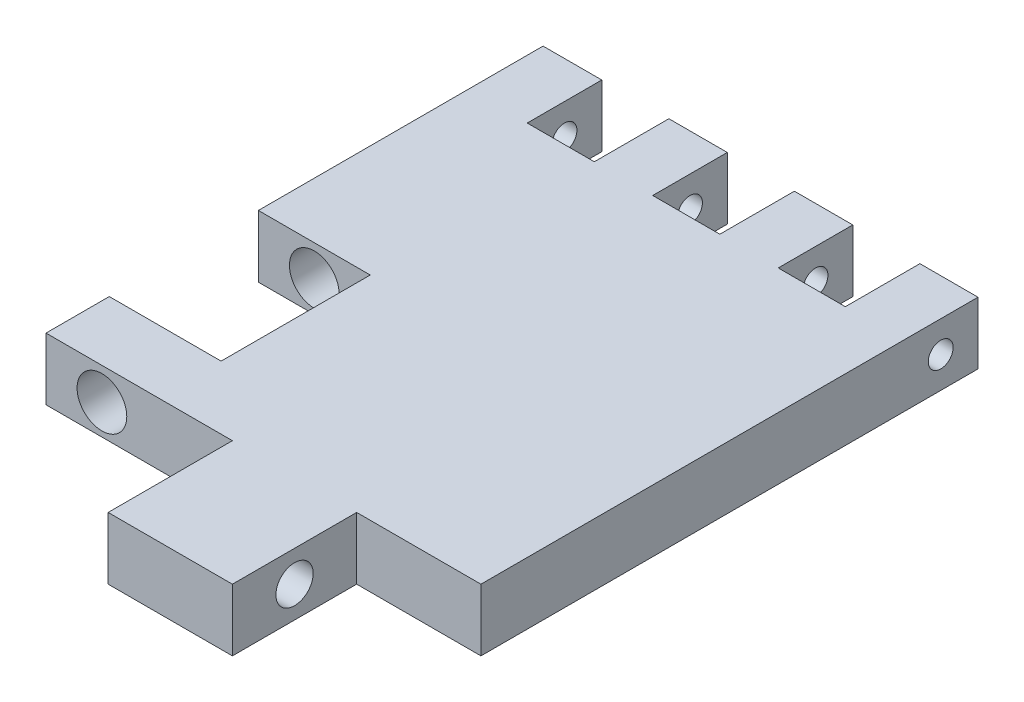
ISO-10303-21;
HEADER;
FILE_DESCRIPTION(('STEP AP214'),'2;1');
FILE_NAME('part.step','',(''),(''),'','','');
FILE_SCHEMA(('AUTOMOTIVE_DESIGN { 1 0 10303 214 1 1 1 1 }'));
ENDSEC;
DATA;
#1=APPLICATION_CONTEXT('core data for automotive mechanical design processes');
#2=APPLICATION_PROTOCOL_DEFINITION('international standard','automotive_design',2000,#1);
#3=PRODUCT_CONTEXT('',#1,'mechanical');
#4=PRODUCT('Part','Part','',(#3));
#5=PRODUCT_RELATED_PRODUCT_CATEGORY('part','',(#4));
#6=PRODUCT_DEFINITION_FORMATION('','',#4);
#7=PRODUCT_DEFINITION_CONTEXT('part definition',#1,'design');
#8=PRODUCT_DEFINITION('design','',#6,#7);
#9=PRODUCT_DEFINITION_SHAPE('','',#8);
#10=(LENGTH_UNIT() NAMED_UNIT(*) SI_UNIT(.MILLI.,.METRE.));
#11=(NAMED_UNIT(*) PLANE_ANGLE_UNIT() SI_UNIT($,.RADIAN.));
#12=(NAMED_UNIT(*) SI_UNIT($,.STERADIAN.) SOLID_ANGLE_UNIT());
#13=UNCERTAINTY_MEASURE_WITH_UNIT(LENGTH_MEASURE(1.E-05),#10,'distance_accuracy_value','');
#14=(GEOMETRIC_REPRESENTATION_CONTEXT(3) GLOBAL_UNCERTAINTY_ASSIGNED_CONTEXT((#13)) GLOBAL_UNIT_ASSIGNED_CONTEXT((#10,
#11,#12)) REPRESENTATION_CONTEXT('',''));
#15=CARTESIAN_POINT('',(0.,0.,0.));
#16=DIRECTION('',(0.,0.,1.));
#17=DIRECTION('',(1.,0.,0.));
#18=AXIS2_PLACEMENT_3D('',#15,#16,#17);
#19=CARTESIAN_POINT('',(0.,12.7,0.));
#20=DIRECTION('',(1.,0.,0.));
#21=DIRECTION('',(0.,0.,-1.));
#22=AXIS2_PLACEMENT_3D('',#19,#20,#21);
#23=PLANE('',#22);
#24=CARTESIAN_POINT('',(0.,6.35,-93.98));
#25=DIRECTION('',(-1.,0.,0.));
#26=DIRECTION('',(0.,0.,1.));
#27=AXIS2_PLACEMENT_3D('',#24,#25,#26);
#28=CIRCLE('',#27,2.54);
#29=CARTESIAN_POINT('',(0.,6.35,-91.44));
#30=VERTEX_POINT('',#29);
#31=EDGE_CURVE('E270',#30,#30,#28,.T.);
#32=ORIENTED_EDGE('',*,*,#31,.F.);
#33=EDGE_LOOP('',(#32));
#34=FACE_BOUND('',#33,.T.);
#35=DIRECTION('',(0.,0.,1.));
#36=VECTOR('',#35,1.);
#37=CARTESIAN_POINT('',(0.,0.,0.));
#38=LINE('',#37,#36);
#39=CARTESIAN_POINT('',(0.,0.,-101.6));
#40=VERTEX_POINT('',#39);
#41=CARTESIAN_POINT('',(0.,0.,-43.412925587905));
#42=VERTEX_POINT('',#41);
#43=EDGE_CURVE('E220',#40,#42,#38,.T.);
#44=ORIENTED_EDGE('',*,*,#43,.T.);
#45=DIRECTION('',(0.,-1.,0.));
#46=VECTOR('',#45,1.);
#47=CARTESIAN_POINT('',(0.,18.288,-43.412925587905));
#48=LINE('',#47,#46);
#49=CARTESIAN_POINT('',(0.,12.7,-43.412925587905));
#50=VERTEX_POINT('',#49);
#51=EDGE_CURVE('E214',#50,#42,#48,.T.);
#52=ORIENTED_EDGE('',*,*,#51,.F.);
#53=DIRECTION('',(0.,0.,1.));
#54=VECTOR('',#53,1.);
#55=CARTESIAN_POINT('',(0.,12.7,0.));
#56=LINE('',#55,#54);
#57=CARTESIAN_POINT('',(0.,12.7,-101.6));
#58=VERTEX_POINT('',#57);
#59=EDGE_CURVE('E381',#58,#50,#56,.T.);
#60=ORIENTED_EDGE('',*,*,#59,.F.);
#61=DIRECTION('',(0.,-1.,0.));
#62=VECTOR('',#61,1.);
#63=CARTESIAN_POINT('',(0.,12.7,-101.6));
#64=LINE('',#63,#62);
#65=EDGE_CURVE('E247',#58,#40,#64,.T.);
#66=ORIENTED_EDGE('',*,*,#65,.T.);
#67=EDGE_LOOP('',(#44,#52,#60,#66));
#68=FACE_BOUND('',#67,.T.);
#69=ADVANCED_FACE('F35',(#34,#68),#23,.F.);
#70=CARTESIAN_POINT('',(0.,12.7,-101.6));
#71=DIRECTION('',(0.,0.,1.));
#72=DIRECTION('',(1.,0.,0.));
#73=AXIS2_PLACEMENT_3D('',#70,#71,#72);
#74=PLANE('',#73);
#75=DIRECTION('',(-1.,0.,0.));
#76=VECTOR('',#75,1.);
#77=CARTESIAN_POINT('',(0.,12.7,-101.6));
#78=LINE('',#77,#76);
#79=CARTESIAN_POINT('',(63.308,12.7,-101.6));
#80=VERTEX_POINT('',#79);
#81=CARTESIAN_POINT('',(51.37,12.7,-101.6));
#82=VERTEX_POINT('',#81);
#83=EDGE_CURVE('E399',#80,#82,#78,.T.);
#84=ORIENTED_EDGE('',*,*,#83,.F.);
#85=DIRECTION('',(0.,1.,0.));
#86=VECTOR('',#85,1.);
#87=CARTESIAN_POINT('',(63.308,0.,-101.6));
#88=LINE('',#87,#86);
#89=CARTESIAN_POINT('',(63.308,0.,-101.6));
#90=VERTEX_POINT('',#89);
#91=EDGE_CURVE('E325',#90,#80,#88,.T.);
#92=ORIENTED_EDGE('',*,*,#91,.F.);
#93=DIRECTION('',(-1.,0.,0.));
#94=VECTOR('',#93,1.);
#95=CARTESIAN_POINT('',(0.,0.,-101.6));
#96=LINE('',#95,#94);
#97=CARTESIAN_POINT('',(51.37,0.,-101.6));
#98=VERTEX_POINT('',#97);
#99=EDGE_CURVE('E245',#90,#98,#96,.T.);
#100=ORIENTED_EDGE('',*,*,#99,.T.);
#101=DIRECTION('',(0.,1.,0.));
#102=VECTOR('',#101,1.);
#103=CARTESIAN_POINT('',(51.37,0.,-101.6));
#104=LINE('',#103,#102);
#105=EDGE_CURVE('E352',#98,#82,#104,.T.);
#106=ORIENTED_EDGE('',*,*,#105,.T.);
#107=EDGE_LOOP('',(#84,#92,#100,#106));
#108=FACE_BOUND('',#107,.T.);
#109=ADVANCED_FACE('F412',(#108),#74,.F.);
#110=CARTESIAN_POINT('',(37.654,12.7,-101.6));
#111=VERTEX_POINT('',#110);
#112=CARTESIAN_POINT('',(25.716,12.7,-101.6));
#113=VERTEX_POINT('',#112);
#114=EDGE_CURVE('E398',#111,#113,#78,.T.);
#115=ORIENTED_EDGE('',*,*,#114,.F.);
#116=DIRECTION('',(0.,1.,0.));
#117=VECTOR('',#116,1.);
#118=CARTESIAN_POINT('',(37.654,0.,-101.6));
#119=LINE('',#118,#117);
#120=CARTESIAN_POINT('',(37.654,0.,-101.6));
#121=VERTEX_POINT('',#120);
#122=EDGE_CURVE('E321',#121,#111,#119,.T.);
#123=ORIENTED_EDGE('',*,*,#122,.F.);
#124=CARTESIAN_POINT('',(25.716,0.,-101.6));
#125=VERTEX_POINT('',#124);
#126=EDGE_CURVE('E246',#121,#125,#96,.T.);
#127=ORIENTED_EDGE('',*,*,#126,.T.);
#128=DIRECTION('',(0.,1.,0.));
#129=VECTOR('',#128,1.);
#130=CARTESIAN_POINT('',(25.716,0.,-101.6));
#131=LINE('',#130,#129);
#132=EDGE_CURVE('E224',#125,#113,#131,.T.);
#133=ORIENTED_EDGE('',*,*,#132,.T.);
#134=EDGE_LOOP('',(#115,#123,#127,#133));
#135=FACE_BOUND('',#134,.T.);
#136=ADVANCED_FACE('F428',(#135),#74,.F.);
#137=CARTESIAN_POINT('',(12.,12.7,-101.6));
#138=VERTEX_POINT('',#137);
#139=EDGE_CURVE('E394',#138,#58,#78,.T.);
#140=ORIENTED_EDGE('',*,*,#139,.F.);
#141=DIRECTION('',(0.,1.,0.));
#142=VECTOR('',#141,1.);
#143=CARTESIAN_POINT('',(12.,0.,-101.6));
#144=LINE('',#143,#142);
#145=CARTESIAN_POINT('',(12.,0.,-101.6));
#146=VERTEX_POINT('',#145);
#147=EDGE_CURVE('E221',#146,#138,#144,.T.);
#148=ORIENTED_EDGE('',*,*,#147,.F.);
#149=EDGE_CURVE('E241',#146,#40,#96,.T.);
#150=ORIENTED_EDGE('',*,*,#149,.T.);
#151=ORIENTED_EDGE('',*,*,#65,.F.);
#152=EDGE_LOOP('',(#140,#148,#150,#151));
#153=FACE_BOUND('',#152,.T.);
#154=ADVANCED_FACE('F441',(#153),#74,.F.);
#155=CARTESIAN_POINT('',(0.,12.7,-12.932925587905));
#156=VERTEX_POINT('',#155);
#157=CARTESIAN_POINT('',(0.,12.7,0.));
#158=VERTEX_POINT('',#157);
#159=EDGE_CURVE('E213',#156,#158,#56,.T.);
#160=ORIENTED_EDGE('',*,*,#159,.F.);
#161=DIRECTION('',(0.,-1.,0.));
#162=VECTOR('',#161,1.);
#163=CARTESIAN_POINT('',(0.,18.288,-12.932925587905));
#164=LINE('',#163,#162);
#165=CARTESIAN_POINT('',(0.,0.,-12.932925587905));
#166=VERTEX_POINT('',#165);
#167=EDGE_CURVE('E201',#156,#166,#164,.T.);
#168=ORIENTED_EDGE('',*,*,#167,.T.);
#169=CARTESIAN_POINT('',(0.,0.,0.));
#170=VERTEX_POINT('',#169);
#171=EDGE_CURVE('E211',#166,#170,#38,.T.);
#172=ORIENTED_EDGE('',*,*,#171,.T.);
#173=DIRECTION('',(0.,-1.,0.));
#174=VECTOR('',#173,1.);
#175=CARTESIAN_POINT('',(0.,12.7,0.));
#176=LINE('',#175,#174);
#177=EDGE_CURVE('E11',#158,#170,#176,.T.);
#178=ORIENTED_EDGE('',*,*,#177,.F.);
#179=EDGE_LOOP('',(#160,#168,#172,#178));
#180=FACE_BOUND('',#179,.T.);
#181=ADVANCED_FACE('F37',(#180),#23,.F.);
#182=CARTESIAN_POINT('',(0.,12.7,0.));
#183=DIRECTION('',(0.,0.,-1.));
#184=DIRECTION('',(-1.,0.,0.));
#185=AXIS2_PLACEMENT_3D('',#182,#183,#184);
#186=PLANE('',#185);
#187=CARTESIAN_POINT('',(11.43,6.16874082807506,0.));
#188=DIRECTION('',(0.,0.,1.));
#189=DIRECTION('',(1.,0.,0.));
#190=AXIS2_PLACEMENT_3D('',#187,#188,#189);
#191=CIRCLE('',#190,5.08);
#192=CARTESIAN_POINT('',(16.51,6.16874082807506,0.));
#193=VERTEX_POINT('',#192);
#194=EDGE_CURVE('E460',#193,#193,#191,.T.);
#195=ORIENTED_EDGE('',*,*,#194,.F.);
#196=EDGE_LOOP('',(#195));
#197=FACE_BOUND('',#196,.T.);
#198=DIRECTION('',(1.,0.,0.));
#199=VECTOR('',#198,1.);
#200=CARTESIAN_POINT('',(0.,0.,0.));
#201=LINE('',#200,#199);
#202=CARTESIAN_POINT('',(38.1,0.,0.));
#203=VERTEX_POINT('',#202);
#204=EDGE_CURVE('E219',#170,#203,#201,.T.);
#205=ORIENTED_EDGE('',*,*,#204,.T.);
#206=DIRECTION('',(0.,-1.,0.));
#207=VECTOR('',#206,1.);
#208=CARTESIAN_POINT('',(38.1,12.7,0.));
#209=LINE('',#208,#207);
#210=CARTESIAN_POINT('',(38.1,12.7,0.));
#211=VERTEX_POINT('',#210);
#212=EDGE_CURVE('E44',#211,#203,#209,.T.);
#213=ORIENTED_EDGE('',*,*,#212,.F.);
#214=DIRECTION('',(1.,0.,0.));
#215=VECTOR('',#214,1.);
#216=CARTESIAN_POINT('',(0.,12.7,0.));
#217=LINE('',#216,#215);
#218=EDGE_CURVE('E384',#158,#211,#217,.T.);
#219=ORIENTED_EDGE('',*,*,#218,.F.);
#220=ORIENTED_EDGE('',*,*,#177,.T.);
#221=EDGE_LOOP('',(#205,#213,#219,#220));
#222=FACE_BOUND('',#221,.T.);
#223=ADVANCED_FACE('F494',(#197,#222),#186,.F.);
#224=CARTESIAN_POINT('',(38.1,12.7,0.));
#225=DIRECTION('',(1.,0.,0.));
#226=DIRECTION('',(0.,0.,-1.));
#227=AXIS2_PLACEMENT_3D('',#224,#225,#226);
#228=PLANE('',#227);
#229=CARTESIAN_POINT('',(38.1,6.35,12.7));
#230=DIRECTION('',(1.,0.,0.));
#231=DIRECTION('',(0.,0.,-1.));
#232=AXIS2_PLACEMENT_3D('',#229,#230,#231);
#233=CIRCLE('',#232,3.81);
#234=CARTESIAN_POINT('',(38.1,6.35,8.88999999999998));
#235=VERTEX_POINT('',#234);
#236=EDGE_CURVE('E273',#235,#235,#233,.T.);
#237=ORIENTED_EDGE('',*,*,#236,.T.);
#238=EDGE_LOOP('',(#237));
#239=FACE_BOUND('',#238,.T.);
#240=DIRECTION('',(0.,0.,1.));
#241=VECTOR('',#240,1.);
#242=CARTESIAN_POINT('',(38.1,0.,0.));
#243=LINE('',#242,#241);
#244=CARTESIAN_POINT('',(38.1,0.,25.4000000000001));
#245=VERTEX_POINT('',#244);
#246=EDGE_CURVE('E231',#203,#245,#243,.T.);
#247=ORIENTED_EDGE('',*,*,#246,.T.);
#248=DIRECTION('',(0.,-1.,0.));
#249=VECTOR('',#248,1.);
#250=CARTESIAN_POINT('',(38.1,12.7,25.4000000000001));
#251=LINE('',#250,#249);
#252=CARTESIAN_POINT('',(38.1,12.7,25.4000000000001));
#253=VERTEX_POINT('',#252);
#254=EDGE_CURVE('E262',#253,#245,#251,.T.);
#255=ORIENTED_EDGE('',*,*,#254,.F.);
#256=DIRECTION('',(0.,0.,1.));
#257=VECTOR('',#256,1.);
#258=CARTESIAN_POINT('',(38.1,12.7,0.));
#259=LINE('',#258,#257);
#260=EDGE_CURVE('E386',#211,#253,#259,.T.);
#261=ORIENTED_EDGE('',*,*,#260,.F.);
#262=ORIENTED_EDGE('',*,*,#212,.T.);
#263=EDGE_LOOP('',(#247,#255,#261,#262));
#264=FACE_BOUND('',#263,.T.);
#265=ADVANCED_FACE('F499',(#239,#264),#228,.F.);
#266=CARTESIAN_POINT('',(63.5,12.7,25.4000000000001));
#267=DIRECTION('',(0.,0.,-1.));
#268=DIRECTION('',(-1.,0.,0.));
#269=AXIS2_PLACEMENT_3D('',#266,#267,#268);
#270=PLANE('',#269);
#271=DIRECTION('',(1.,0.,0.));
#272=VECTOR('',#271,1.);
#273=CARTESIAN_POINT('',(63.5,0.,25.4000000000001));
#274=LINE('',#273,#272);
#275=CARTESIAN_POINT('',(63.5,0.,25.4000000000001));
#276=VERTEX_POINT('',#275);
#277=EDGE_CURVE('E233',#245,#276,#274,.T.);
#278=ORIENTED_EDGE('',*,*,#277,.T.);
#279=DIRECTION('',(0.,-1.,0.));
#280=VECTOR('',#279,1.);
#281=CARTESIAN_POINT('',(63.5,12.7,25.4000000000001));
#282=LINE('',#281,#280);
#283=CARTESIAN_POINT('',(63.5,12.7,25.4000000000001));
#284=VERTEX_POINT('',#283);
#285=EDGE_CURVE('E259',#284,#276,#282,.T.);
#286=ORIENTED_EDGE('',*,*,#285,.F.);
#287=DIRECTION('',(1.,0.,0.));
#288=VECTOR('',#287,1.);
#289=CARTESIAN_POINT('',(63.5,12.7,25.4000000000001));
#290=LINE('',#289,#288);
#291=EDGE_CURVE('E388',#253,#284,#290,.T.);
#292=ORIENTED_EDGE('',*,*,#291,.F.);
#293=ORIENTED_EDGE('',*,*,#254,.T.);
#294=EDGE_LOOP('',(#278,#286,#292,#293));
#295=FACE_BOUND('',#294,.T.);
#296=ADVANCED_FACE('F708',(#295),#270,.F.);
#297=CARTESIAN_POINT('',(63.5,12.7,0.));
#298=DIRECTION('',(-1.,0.,0.));
#299=DIRECTION('',(0.,0.,1.));
#300=AXIS2_PLACEMENT_3D('',#297,#298,#299);
#301=PLANE('',#300);
#302=CARTESIAN_POINT('',(63.5,6.35,12.7));
#303=DIRECTION('',(-1.,0.,0.));
#304=DIRECTION('',(0.,0.,1.));
#305=AXIS2_PLACEMENT_3D('',#302,#303,#304);
#306=CIRCLE('',#305,3.81);
#307=CARTESIAN_POINT('',(63.5,6.35,16.51));
#308=VERTEX_POINT('',#307);
#309=EDGE_CURVE('E271',#308,#308,#306,.T.);
#310=ORIENTED_EDGE('',*,*,#309,.T.);
#311=EDGE_LOOP('',(#310));
#312=FACE_BOUND('',#311,.T.);
#313=DIRECTION('',(0.,0.,-1.));
#314=VECTOR('',#313,1.);
#315=CARTESIAN_POINT('',(63.5,0.,0.));
#316=LINE('',#315,#314);
#317=CARTESIAN_POINT('',(63.5,0.,0.));
#318=VERTEX_POINT('',#317);
#319=EDGE_CURVE('E235',#276,#318,#316,.T.);
#320=ORIENTED_EDGE('',*,*,#319,.T.);
#321=DIRECTION('',(0.,-1.,0.));
#322=VECTOR('',#321,1.);
#323=CARTESIAN_POINT('',(63.5,12.7,0.));
#324=LINE('',#323,#322);
#325=CARTESIAN_POINT('',(63.5,12.7,0.));
#326=VERTEX_POINT('',#325);
#327=EDGE_CURVE('E256',#326,#318,#324,.T.);
#328=ORIENTED_EDGE('',*,*,#327,.F.);
#329=DIRECTION('',(0.,0.,-1.));
#330=VECTOR('',#329,1.);
#331=CARTESIAN_POINT('',(63.5,12.7,0.));
#332=LINE('',#331,#330);
#333=EDGE_CURVE('E390',#284,#326,#332,.T.);
#334=ORIENTED_EDGE('',*,*,#333,.F.);
#335=ORIENTED_EDGE('',*,*,#285,.T.);
#336=EDGE_LOOP('',(#320,#328,#334,#335));
#337=FACE_BOUND('',#336,.T.);
#338=ADVANCED_FACE('F700',(#312,#337),#301,.F.);
#339=CARTESIAN_POINT('',(63.5,12.7,0.));
#340=DIRECTION('',(0.,0.,-1.));
#341=DIRECTION('',(-1.,0.,0.));
#342=AXIS2_PLACEMENT_3D('',#339,#340,#341);
#343=PLANE('',#342);
#344=DIRECTION('',(1.,0.,0.));
#345=VECTOR('',#344,1.);
#346=CARTESIAN_POINT('',(63.5,0.,0.));
#347=LINE('',#346,#345);
#348=CARTESIAN_POINT('',(88.9,0.,0.));
#349=VERTEX_POINT('',#348);
#350=EDGE_CURVE('E237',#318,#349,#347,.T.);
#351=ORIENTED_EDGE('',*,*,#350,.T.);
#352=DIRECTION('',(0.,-1.,0.));
#353=VECTOR('',#352,1.);
#354=CARTESIAN_POINT('',(88.9,12.7,0.));
#355=LINE('',#354,#353);
#356=CARTESIAN_POINT('',(88.9,12.7,0.));
#357=VERTEX_POINT('',#356);
#358=EDGE_CURVE('E253',#357,#349,#355,.T.);
#359=ORIENTED_EDGE('',*,*,#358,.F.);
#360=DIRECTION('',(1.,0.,0.));
#361=VECTOR('',#360,1.);
#362=CARTESIAN_POINT('',(63.5,12.7,0.));
#363=LINE('',#362,#361);
#364=EDGE_CURVE('E392',#326,#357,#363,.T.);
#365=ORIENTED_EDGE('',*,*,#364,.F.);
#366=ORIENTED_EDGE('',*,*,#327,.T.);
#367=EDGE_LOOP('',(#351,#359,#365,#366));
#368=FACE_BOUND('',#367,.T.);
#369=ADVANCED_FACE('F514',(#368),#343,.F.);
#370=CARTESIAN_POINT('',(88.9,12.7,0.));
#371=DIRECTION('',(-1.,0.,0.));
#372=DIRECTION('',(0.,0.,1.));
#373=AXIS2_PLACEMENT_3D('',#370,#371,#372);
#374=PLANE('',#373);
#375=CARTESIAN_POINT('',(88.9,6.35,-93.98));
#376=DIRECTION('',(-1.,0.,0.));
#377=DIRECTION('',(0.,0.,1.));
#378=AXIS2_PLACEMENT_3D('',#375,#376,#377);
#379=CIRCLE('',#378,2.54);
#380=CARTESIAN_POINT('',(88.9,6.35,-91.44));
#381=VERTEX_POINT('',#380);
#382=EDGE_CURVE('E304',#381,#381,#379,.T.);
#383=ORIENTED_EDGE('',*,*,#382,.T.);
#384=EDGE_LOOP('',(#383));
#385=FACE_BOUND('',#384,.T.);
#386=DIRECTION('',(0.,0.,-1.));
#387=VECTOR('',#386,1.);
#388=CARTESIAN_POINT('',(88.9,0.,0.));
#389=LINE('',#388,#387);
#390=CARTESIAN_POINT('',(88.9,0.,-101.6));
#391=VERTEX_POINT('',#390);
#392=EDGE_CURVE('E239',#349,#391,#389,.T.);
#393=ORIENTED_EDGE('',*,*,#392,.T.);
#394=DIRECTION('',(0.,-1.,0.));
#395=VECTOR('',#394,1.);
#396=CARTESIAN_POINT('',(88.9,12.7,-101.6));
#397=LINE('',#396,#395);
#398=CARTESIAN_POINT('',(88.9,12.7,-101.6));
#399=VERTEX_POINT('',#398);
#400=EDGE_CURVE('E250',#399,#391,#397,.T.);
#401=ORIENTED_EDGE('',*,*,#400,.F.);
#402=DIRECTION('',(0.,0.,-1.));
#403=VECTOR('',#402,1.);
#404=CARTESIAN_POINT('',(88.9,12.7,0.));
#405=LINE('',#404,#403);
#406=EDGE_CURVE('E393',#357,#399,#405,.T.);
#407=ORIENTED_EDGE('',*,*,#406,.F.);
#408=ORIENTED_EDGE('',*,*,#358,.T.);
#409=EDGE_LOOP('',(#393,#401,#407,#408));
#410=FACE_BOUND('',#409,.T.);
#411=ADVANCED_FACE('F507',(#385,#410),#374,.F.);
#412=CARTESIAN_POINT('',(77.024,0.,-101.6));
#413=VERTEX_POINT('',#412);
#414=EDGE_CURVE('E242',#391,#413,#96,.T.);
#415=ORIENTED_EDGE('',*,*,#414,.T.);
#416=DIRECTION('',(0.,1.,0.));
#417=VECTOR('',#416,1.);
#418=CARTESIAN_POINT('',(77.024,0.,-101.6));
#419=LINE('',#418,#417);
#420=CARTESIAN_POINT('',(77.024,12.7,-101.6));
#421=VERTEX_POINT('',#420);
#422=EDGE_CURVE('E328',#413,#421,#419,.T.);
#423=ORIENTED_EDGE('',*,*,#422,.T.);
#424=EDGE_CURVE('E228',#399,#421,#78,.T.);
#425=ORIENTED_EDGE('',*,*,#424,.F.);
#426=ORIENTED_EDGE('',*,*,#400,.T.);
#427=EDGE_LOOP('',(#415,#423,#425,#426));
#428=FACE_BOUND('',#427,.T.);
#429=ADVANCED_FACE('F491',(#428),#74,.F.);
#430=CARTESIAN_POINT('',(0.,12.7,0.));
#431=DIRECTION('',(0.,-1.,0.));
#432=DIRECTION('',(0.,0.,-1.));
#433=AXIS2_PLACEMENT_3D('',#430,#431,#432);
#434=PLANE('',#433);
#435=ORIENTED_EDGE('',*,*,#59,.T.);
#436=DIRECTION('',(1.,0.,0.));
#437=VECTOR('',#436,1.);
#438=CARTESIAN_POINT('',(0.,12.7,-43.412925587905));
#439=LINE('',#438,#437);
#440=CARTESIAN_POINT('',(22.86,12.7,-43.412925587905));
#441=VERTEX_POINT('',#440);
#442=EDGE_CURVE('E280',#50,#441,#439,.T.);
#443=ORIENTED_EDGE('',*,*,#442,.T.);
#444=DIRECTION('',(0.,0.,1.));
#445=VECTOR('',#444,1.);
#446=CARTESIAN_POINT('',(22.86,12.7,0.));
#447=LINE('',#446,#445);
#448=CARTESIAN_POINT('',(22.86,12.7,-12.932925587905));
#449=VERTEX_POINT('',#448);
#450=EDGE_CURVE('E274',#441,#449,#447,.T.);
#451=ORIENTED_EDGE('',*,*,#450,.T.);
#452=DIRECTION('',(-1.,0.,0.));
#453=VECTOR('',#452,1.);
#454=CARTESIAN_POINT('',(0.,12.7,-12.932925587905));
#455=LINE('',#454,#453);
#456=EDGE_CURVE('E284',#449,#156,#455,.T.);
#457=ORIENTED_EDGE('',*,*,#456,.T.);
#458=ORIENTED_EDGE('',*,*,#159,.T.);
#459=ORIENTED_EDGE('',*,*,#218,.T.);
#460=ORIENTED_EDGE('',*,*,#260,.T.);
#461=ORIENTED_EDGE('',*,*,#291,.T.);
#462=ORIENTED_EDGE('',*,*,#333,.T.);
#463=ORIENTED_EDGE('',*,*,#364,.T.);
#464=ORIENTED_EDGE('',*,*,#406,.T.);
#465=ORIENTED_EDGE('',*,*,#424,.T.);
#466=DIRECTION('',(0.,0.,-1.));
#467=VECTOR('',#466,1.);
#468=CARTESIAN_POINT('',(77.024,12.7,-101.6));
#469=LINE('',#468,#467);
#470=CARTESIAN_POINT('',(77.024,12.7,-86.36));
#471=VERTEX_POINT('',#470);
#472=EDGE_CURVE('E312',#471,#421,#469,.T.);
#473=ORIENTED_EDGE('',*,*,#472,.F.);
#474=DIRECTION('',(1.,0.,0.));
#475=VECTOR('',#474,1.);
#476=CARTESIAN_POINT('',(63.308,12.7,-86.36));
#477=LINE('',#476,#475);
#478=CARTESIAN_POINT('',(63.308,12.7,-86.36));
#479=VERTEX_POINT('',#478);
#480=EDGE_CURVE('E320',#479,#471,#477,.T.);
#481=ORIENTED_EDGE('',*,*,#480,.F.);
#482=DIRECTION('',(0.,0.,1.));
#483=VECTOR('',#482,1.);
#484=CARTESIAN_POINT('',(63.308,12.7,-101.6));
#485=LINE('',#484,#483);
#486=EDGE_CURVE('E317',#80,#479,#485,.T.);
#487=ORIENTED_EDGE('',*,*,#486,.F.);
#488=ORIENTED_EDGE('',*,*,#83,.T.);
#489=DIRECTION('',(0.,0.,-1.));
#490=VECTOR('',#489,1.);
#491=CARTESIAN_POINT('',(51.37,12.7,-101.6));
#492=LINE('',#491,#490);
#493=CARTESIAN_POINT('',(51.37,12.7,-86.36));
#494=VERTEX_POINT('',#493);
#495=EDGE_CURVE('E338',#494,#82,#492,.T.);
#496=ORIENTED_EDGE('',*,*,#495,.F.);
#497=DIRECTION('',(1.,0.,0.));
#498=VECTOR('',#497,1.);
#499=CARTESIAN_POINT('',(37.654,12.7,-86.36));
#500=LINE('',#499,#498);
#501=CARTESIAN_POINT('',(37.654,12.7,-86.36));
#502=VERTEX_POINT('',#501);
#503=EDGE_CURVE('E347',#502,#494,#500,.T.);
#504=ORIENTED_EDGE('',*,*,#503,.F.);
#505=DIRECTION('',(0.,0.,1.));
#506=VECTOR('',#505,1.);
#507=CARTESIAN_POINT('',(37.654,12.7,-101.6));
#508=LINE('',#507,#506);
#509=EDGE_CURVE('E307',#111,#502,#508,.T.);
#510=ORIENTED_EDGE('',*,*,#509,.F.);
#511=ORIENTED_EDGE('',*,*,#114,.T.);
#512=DIRECTION('',(0.,0.,-1.));
#513=VECTOR('',#512,1.);
#514=CARTESIAN_POINT('',(25.716,12.7,-101.6));
#515=LINE('',#514,#513);
#516=CARTESIAN_POINT('',(25.716,12.7,-86.36));
#517=VERTEX_POINT('',#516);
#518=EDGE_CURVE('E362',#517,#113,#515,.T.);
#519=ORIENTED_EDGE('',*,*,#518,.F.);
#520=DIRECTION('',(1.,0.,0.));
#521=VECTOR('',#520,1.);
#522=CARTESIAN_POINT('',(12.,12.7,-86.36));
#523=LINE('',#522,#521);
#524=CARTESIAN_POINT('',(12.,12.7,-86.36));
#525=VERTEX_POINT('',#524);
#526=EDGE_CURVE('E371',#525,#517,#523,.T.);
#527=ORIENTED_EDGE('',*,*,#526,.F.);
#528=DIRECTION('',(0.,0.,1.));
#529=VECTOR('',#528,1.);
#530=CARTESIAN_POINT('',(12.,12.7,-101.6));
#531=LINE('',#530,#529);
#532=EDGE_CURVE('E327',#138,#525,#531,.T.);
#533=ORIENTED_EDGE('',*,*,#532,.F.);
#534=ORIENTED_EDGE('',*,*,#139,.T.);
#535=EDGE_LOOP('',(#435,#443,#451,#457,#458,#459,#460,#461,#462,#463,#464,#465,#473,#481,#487,
#488,#496,#504,#510,#511,#519,#527,#533,#534));
#536=FACE_BOUND('',#535,.T.);
#537=ADVANCED_FACE('F407',(#536),#434,.F.);
#538=CARTESIAN_POINT('',(0.,0.,0.));
#539=DIRECTION('',(0.,-1.,0.));
#540=DIRECTION('',(0.,0.,-1.));
#541=AXIS2_PLACEMENT_3D('',#538,#539,#540);
#542=PLANE('',#541);
#543=DIRECTION('',(1.,0.,0.));
#544=VECTOR('',#543,1.);
#545=CARTESIAN_POINT('',(22.86,0.,-43.412925587905));
#546=LINE('',#545,#544);
#547=CARTESIAN_POINT('',(22.86,0.,-43.412925587905));
#548=VERTEX_POINT('',#547);
#549=EDGE_CURVE('E206',#42,#548,#546,.T.);
#550=ORIENTED_EDGE('',*,*,#549,.F.);
#551=ORIENTED_EDGE('',*,*,#43,.F.);
#552=ORIENTED_EDGE('',*,*,#149,.F.);
#553=DIRECTION('',(0.,0.,1.));
#554=VECTOR('',#553,1.);
#555=CARTESIAN_POINT('',(12.,0.,-101.6));
#556=LINE('',#555,#554);
#557=CARTESIAN_POINT('',(12.,0.,-86.36));
#558=VERTEX_POINT('',#557);
#559=EDGE_CURVE('E358',#146,#558,#556,.T.);
#560=ORIENTED_EDGE('',*,*,#559,.T.);
#561=DIRECTION('',(1.,0.,0.));
#562=VECTOR('',#561,1.);
#563=CARTESIAN_POINT('',(12.,0.,-86.36));
#564=LINE('',#563,#562);
#565=CARTESIAN_POINT('',(25.716,0.,-86.36));
#566=VERTEX_POINT('',#565);
#567=EDGE_CURVE('E361',#558,#566,#564,.T.);
#568=ORIENTED_EDGE('',*,*,#567,.T.);
#569=DIRECTION('',(0.,0.,-1.));
#570=VECTOR('',#569,1.);
#571=CARTESIAN_POINT('',(25.716,0.,-101.6));
#572=LINE('',#571,#570);
#573=EDGE_CURVE('E365',#566,#125,#572,.T.);
#574=ORIENTED_EDGE('',*,*,#573,.T.);
#575=ORIENTED_EDGE('',*,*,#126,.F.);
#576=DIRECTION('',(0.,0.,1.));
#577=VECTOR('',#576,1.);
#578=CARTESIAN_POINT('',(37.654,0.,-101.6));
#579=LINE('',#578,#577);
#580=CARTESIAN_POINT('',(37.654,0.,-86.36));
#581=VERTEX_POINT('',#580);
#582=EDGE_CURVE('E334',#121,#581,#579,.T.);
#583=ORIENTED_EDGE('',*,*,#582,.T.);
#584=DIRECTION('',(1.,0.,0.));
#585=VECTOR('',#584,1.);
#586=CARTESIAN_POINT('',(37.654,0.,-86.36));
#587=LINE('',#586,#585);
#588=CARTESIAN_POINT('',(51.37,0.,-86.36));
#589=VERTEX_POINT('',#588);
#590=EDGE_CURVE('E337',#581,#589,#587,.T.);
#591=ORIENTED_EDGE('',*,*,#590,.T.);
#592=DIRECTION('',(0.,0.,-1.));
#593=VECTOR('',#592,1.);
#594=CARTESIAN_POINT('',(51.37,0.,-101.6));
#595=LINE('',#594,#593);
#596=EDGE_CURVE('E341',#589,#98,#595,.T.);
#597=ORIENTED_EDGE('',*,*,#596,.T.);
#598=ORIENTED_EDGE('',*,*,#99,.F.);
#599=DIRECTION('',(0.,0.,1.));
#600=VECTOR('',#599,1.);
#601=CARTESIAN_POINT('',(63.308,0.,-101.6));
#602=LINE('',#601,#600);
#603=CARTESIAN_POINT('',(63.308,0.,-86.36));
#604=VERTEX_POINT('',#603);
#605=EDGE_CURVE('E308',#90,#604,#602,.T.);
#606=ORIENTED_EDGE('',*,*,#605,.T.);
#607=DIRECTION('',(1.,0.,0.));
#608=VECTOR('',#607,1.);
#609=CARTESIAN_POINT('',(63.308,0.,-86.36));
#610=LINE('',#609,#608);
#611=CARTESIAN_POINT('',(77.024,0.,-86.36));
#612=VERTEX_POINT('',#611);
#613=EDGE_CURVE('E311',#604,#612,#610,.T.);
#614=ORIENTED_EDGE('',*,*,#613,.T.);
#615=DIRECTION('',(0.,0.,-1.));
#616=VECTOR('',#615,1.);
#617=CARTESIAN_POINT('',(77.024,0.,-101.6));
#618=LINE('',#617,#616);
#619=EDGE_CURVE('E60',#612,#413,#618,.T.);
#620=ORIENTED_EDGE('',*,*,#619,.T.);
#621=ORIENTED_EDGE('',*,*,#414,.F.);
#622=ORIENTED_EDGE('',*,*,#392,.F.);
#623=ORIENTED_EDGE('',*,*,#350,.F.);
#624=ORIENTED_EDGE('',*,*,#319,.F.);
#625=ORIENTED_EDGE('',*,*,#277,.F.);
#626=ORIENTED_EDGE('',*,*,#246,.F.);
#627=ORIENTED_EDGE('',*,*,#204,.F.);
#628=ORIENTED_EDGE('',*,*,#171,.F.);
#629=DIRECTION('',(-1.,0.,0.));
#630=VECTOR('',#629,1.);
#631=CARTESIAN_POINT('',(22.86,0.,-12.932925587905));
#632=LINE('',#631,#630);
#633=CARTESIAN_POINT('',(22.86,0.,-12.932925587905));
#634=VERTEX_POINT('',#633);
#635=EDGE_CURVE('E198',#634,#166,#632,.T.);
#636=ORIENTED_EDGE('',*,*,#635,.F.);
#637=DIRECTION('',(0.,0.,1.));
#638=VECTOR('',#637,1.);
#639=CARTESIAN_POINT('',(22.86,0.,-43.412925587905));
#640=LINE('',#639,#638);
#641=EDGE_CURVE('E52',#548,#634,#640,.T.);
#642=ORIENTED_EDGE('',*,*,#641,.F.);
#643=EDGE_LOOP('',(#550,#551,#552,#560,#568,#574,#575,#583,#591,#597,#598,#606,#614,#620,#621,
#622,#623,#624,#625,#626,#627,#628,#636,#642));
#644=FACE_BOUND('',#643,.T.);
#645=ADVANCED_FACE('F217',(#644),#542,.T.);
#646=CARTESIAN_POINT('',(12.,0.,-101.6));
#647=DIRECTION('',(-1.,0.,0.));
#648=DIRECTION('',(0.,0.,1.));
#649=AXIS2_PLACEMENT_3D('',#646,#647,#648);
#650=PLANE('',#649);
#651=CARTESIAN_POINT('',(12.,6.35,-93.98));
#652=DIRECTION('',(-1.,0.,0.));
#653=DIRECTION('',(0.,0.,1.));
#654=AXIS2_PLACEMENT_3D('',#651,#652,#653);
#655=CIRCLE('',#654,2.54);
#656=CARTESIAN_POINT('',(12.,6.35,-91.44));
#657=VERTEX_POINT('',#656);
#658=EDGE_CURVE('E301',#657,#657,#655,.T.);
#659=ORIENTED_EDGE('',*,*,#658,.T.);
#660=EDGE_LOOP('',(#659));
#661=FACE_BOUND('',#660,.T.);
#662=ORIENTED_EDGE('',*,*,#532,.T.);
#663=DIRECTION('',(0.,1.,0.));
#664=VECTOR('',#663,1.);
#665=CARTESIAN_POINT('',(12.,0.,-86.36));
#666=LINE('',#665,#664);
#667=EDGE_CURVE('E368',#558,#525,#666,.T.);
#668=ORIENTED_EDGE('',*,*,#667,.F.);
#669=ORIENTED_EDGE('',*,*,#559,.F.);
#670=ORIENTED_EDGE('',*,*,#147,.T.);
#671=EDGE_LOOP('',(#662,#668,#669,#670));
#672=FACE_BOUND('',#671,.T.);
#673=ADVANCED_FACE('F551',(#661,#672),#650,.F.);
#674=CARTESIAN_POINT('',(25.716,0.,-101.6));
#675=DIRECTION('',(1.,0.,0.));
#676=DIRECTION('',(0.,0.,-1.));
#677=AXIS2_PLACEMENT_3D('',#674,#675,#676);
#678=PLANE('',#677);
#679=CARTESIAN_POINT('',(25.716,6.35,-93.98));
#680=DIRECTION('',(1.,0.,0.));
#681=DIRECTION('',(0.,0.,-1.));
#682=AXIS2_PLACEMENT_3D('',#679,#680,#681);
#683=CIRCLE('',#682,2.54);
#684=CARTESIAN_POINT('',(25.716,6.35,-96.52));
#685=VERTEX_POINT('',#684);
#686=EDGE_CURVE('E298',#685,#685,#683,.T.);
#687=ORIENTED_EDGE('',*,*,#686,.T.);
#688=EDGE_LOOP('',(#687));
#689=FACE_BOUND('',#688,.T.);
#690=ORIENTED_EDGE('',*,*,#518,.T.);
#691=ORIENTED_EDGE('',*,*,#132,.F.);
#692=ORIENTED_EDGE('',*,*,#573,.F.);
#693=DIRECTION('',(0.,1.,0.));
#694=VECTOR('',#693,1.);
#695=CARTESIAN_POINT('',(25.716,0.,-86.36));
#696=LINE('',#695,#694);
#697=EDGE_CURVE('E378',#566,#517,#696,.T.);
#698=ORIENTED_EDGE('',*,*,#697,.T.);
#699=EDGE_LOOP('',(#690,#691,#692,#698));
#700=FACE_BOUND('',#699,.T.);
#701=ADVANCED_FACE('F431',(#689,#700),#678,.F.);
#702=CARTESIAN_POINT('',(12.,0.,-86.36));
#703=DIRECTION('',(0.,0.,1.));
#704=DIRECTION('',(1.,0.,0.));
#705=AXIS2_PLACEMENT_3D('',#702,#703,#704);
#706=PLANE('',#705);
#707=ORIENTED_EDGE('',*,*,#526,.T.);
#708=ORIENTED_EDGE('',*,*,#697,.F.);
#709=ORIENTED_EDGE('',*,*,#567,.F.);
#710=ORIENTED_EDGE('',*,*,#667,.T.);
#711=EDGE_LOOP('',(#707,#708,#709,#710));
#712=FACE_BOUND('',#711,.T.);
#713=ADVANCED_FACE('F436',(#712),#706,.F.);
#714=CARTESIAN_POINT('',(37.654,0.,-101.6));
#715=DIRECTION('',(-1.,0.,0.));
#716=DIRECTION('',(0.,0.,1.));
#717=AXIS2_PLACEMENT_3D('',#714,#715,#716);
#718=PLANE('',#717);
#719=CARTESIAN_POINT('',(37.654,6.35,-93.98));
#720=DIRECTION('',(-1.,0.,0.));
#721=DIRECTION('',(0.,0.,1.));
#722=AXIS2_PLACEMENT_3D('',#719,#720,#721);
#723=CIRCLE('',#722,2.54);
#724=CARTESIAN_POINT('',(37.654,6.35,-91.44));
#725=VERTEX_POINT('',#724);
#726=EDGE_CURVE('E295',#725,#725,#723,.T.);
#727=ORIENTED_EDGE('',*,*,#726,.T.);
#728=EDGE_LOOP('',(#727));
#729=FACE_BOUND('',#728,.T.);
#730=ORIENTED_EDGE('',*,*,#509,.T.);
#731=DIRECTION('',(0.,1.,0.));
#732=VECTOR('',#731,1.);
#733=CARTESIAN_POINT('',(37.654,0.,-86.36));
#734=LINE('',#733,#732);
#735=EDGE_CURVE('E344',#581,#502,#734,.T.);
#736=ORIENTED_EDGE('',*,*,#735,.F.);
#737=ORIENTED_EDGE('',*,*,#582,.F.);
#738=ORIENTED_EDGE('',*,*,#122,.T.);
#739=EDGE_LOOP('',(#730,#736,#737,#738));
#740=FACE_BOUND('',#739,.T.);
#741=ADVANCED_FACE('F542',(#729,#740),#718,.F.);
#742=CARTESIAN_POINT('',(51.37,0.,-101.6));
#743=DIRECTION('',(1.,0.,0.));
#744=DIRECTION('',(0.,0.,-1.));
#745=AXIS2_PLACEMENT_3D('',#742,#743,#744);
#746=PLANE('',#745);
#747=CARTESIAN_POINT('',(51.37,6.35,-93.98));
#748=DIRECTION('',(1.,0.,0.));
#749=DIRECTION('',(0.,0.,-1.));
#750=AXIS2_PLACEMENT_3D('',#747,#748,#749);
#751=CIRCLE('',#750,2.54);
#752=CARTESIAN_POINT('',(51.37,6.35,-96.52));
#753=VERTEX_POINT('',#752);
#754=EDGE_CURVE('E292',#753,#753,#751,.T.);
#755=ORIENTED_EDGE('',*,*,#754,.T.);
#756=EDGE_LOOP('',(#755));
#757=FACE_BOUND('',#756,.T.);
#758=ORIENTED_EDGE('',*,*,#495,.T.);
#759=ORIENTED_EDGE('',*,*,#105,.F.);
#760=ORIENTED_EDGE('',*,*,#596,.F.);
#761=DIRECTION('',(0.,1.,0.));
#762=VECTOR('',#761,1.);
#763=CARTESIAN_POINT('',(51.37,0.,-86.36));
#764=LINE('',#763,#762);
#765=EDGE_CURVE('E355',#589,#494,#764,.T.);
#766=ORIENTED_EDGE('',*,*,#765,.T.);
#767=EDGE_LOOP('',(#758,#759,#760,#766));
#768=FACE_BOUND('',#767,.T.);
#769=ADVANCED_FACE('F416',(#757,#768),#746,.F.);
#770=CARTESIAN_POINT('',(37.654,0.,-86.36));
#771=DIRECTION('',(0.,0.,1.));
#772=DIRECTION('',(1.,0.,0.));
#773=AXIS2_PLACEMENT_3D('',#770,#771,#772);
#774=PLANE('',#773);
#775=ORIENTED_EDGE('',*,*,#503,.T.);
#776=ORIENTED_EDGE('',*,*,#765,.F.);
#777=ORIENTED_EDGE('',*,*,#590,.F.);
#778=ORIENTED_EDGE('',*,*,#735,.T.);
#779=EDGE_LOOP('',(#775,#776,#777,#778));
#780=FACE_BOUND('',#779,.T.);
#781=ADVANCED_FACE('F421',(#780),#774,.F.);
#782=CARTESIAN_POINT('',(63.308,0.,-101.6));
#783=DIRECTION('',(-1.,0.,0.));
#784=DIRECTION('',(0.,0.,1.));
#785=AXIS2_PLACEMENT_3D('',#782,#783,#784);
#786=PLANE('',#785);
#787=CARTESIAN_POINT('',(63.308,6.35,-93.98));
#788=DIRECTION('',(-1.,0.,0.));
#789=DIRECTION('',(0.,0.,1.));
#790=AXIS2_PLACEMENT_3D('',#787,#788,#789);
#791=CIRCLE('',#790,2.54);
#792=CARTESIAN_POINT('',(63.308,6.35,-91.44));
#793=VERTEX_POINT('',#792);
#794=EDGE_CURVE('E269',#793,#793,#791,.T.);
#795=ORIENTED_EDGE('',*,*,#794,.T.);
#796=EDGE_LOOP('',(#795));
#797=FACE_BOUND('',#796,.T.);
#798=ORIENTED_EDGE('',*,*,#486,.T.);
#799=DIRECTION('',(0.,1.,0.));
#800=VECTOR('',#799,1.);
#801=CARTESIAN_POINT('',(63.308,0.,-86.36));
#802=LINE('',#801,#800);
#803=EDGE_CURVE('E316',#604,#479,#802,.T.);
#804=ORIENTED_EDGE('',*,*,#803,.F.);
#805=ORIENTED_EDGE('',*,*,#605,.F.);
#806=ORIENTED_EDGE('',*,*,#91,.T.);
#807=EDGE_LOOP('',(#798,#804,#805,#806));
#808=FACE_BOUND('',#807,.T.);
#809=ADVANCED_FACE('F526',(#797,#808),#786,.F.);
#810=CARTESIAN_POINT('',(77.024,0.,-101.6));
#811=DIRECTION('',(1.,0.,0.));
#812=DIRECTION('',(0.,0.,-1.));
#813=AXIS2_PLACEMENT_3D('',#810,#811,#812);
#814=PLANE('',#813);
#815=CARTESIAN_POINT('',(77.024,6.35,-93.98));
#816=DIRECTION('',(1.,0.,0.));
#817=DIRECTION('',(0.,0.,-1.));
#818=AXIS2_PLACEMENT_3D('',#815,#816,#817);
#819=CIRCLE('',#818,2.54);
#820=CARTESIAN_POINT('',(77.024,6.35,-96.52));
#821=VERTEX_POINT('',#820);
#822=EDGE_CURVE('E267',#821,#821,#819,.T.);
#823=ORIENTED_EDGE('',*,*,#822,.T.);
#824=EDGE_LOOP('',(#823));
#825=FACE_BOUND('',#824,.T.);
#826=ORIENTED_EDGE('',*,*,#472,.T.);
#827=ORIENTED_EDGE('',*,*,#422,.F.);
#828=ORIENTED_EDGE('',*,*,#619,.F.);
#829=DIRECTION('',(0.,1.,0.));
#830=VECTOR('',#829,1.);
#831=CARTESIAN_POINT('',(77.024,0.,-86.36));
#832=LINE('',#831,#830);
#833=EDGE_CURVE('E331',#612,#471,#832,.T.);
#834=ORIENTED_EDGE('',*,*,#833,.T.);
#835=EDGE_LOOP('',(#826,#827,#828,#834));
#836=FACE_BOUND('',#835,.T.);
#837=ADVANCED_FACE('F524',(#825,#836),#814,.F.);
#838=CARTESIAN_POINT('',(63.308,0.,-86.36));
#839=DIRECTION('',(0.,0.,1.));
#840=DIRECTION('',(1.,0.,0.));
#841=AXIS2_PLACEMENT_3D('',#838,#839,#840);
#842=PLANE('',#841);
#843=ORIENTED_EDGE('',*,*,#480,.T.);
#844=ORIENTED_EDGE('',*,*,#833,.F.);
#845=ORIENTED_EDGE('',*,*,#613,.F.);
#846=ORIENTED_EDGE('',*,*,#803,.T.);
#847=EDGE_LOOP('',(#843,#844,#845,#846));
#848=FACE_BOUND('',#847,.T.);
#849=ADVANCED_FACE('F522',(#848),#842,.F.);
#850=CARTESIAN_POINT('',(91.44,6.35,-93.98));
#851=DIRECTION('',(-1.,0.,0.));
#852=DIRECTION('',(0.,0.,1.));
#853=AXIS2_PLACEMENT_3D('',#850,#851,#852);
#854=CYLINDRICAL_SURFACE('',#853,2.54);
#855=ORIENTED_EDGE('',*,*,#822,.F.);
#856=EDGE_LOOP('',(#855));
#857=FACE_BOUND('',#856,.T.);
#858=ORIENTED_EDGE('',*,*,#382,.F.);
#859=EDGE_LOOP('',(#858));
#860=FACE_BOUND('',#859,.T.);
#861=ADVANCED_FACE('F533',(#857,#860),#854,.F.);
#862=ORIENTED_EDGE('',*,*,#794,.F.);
#863=EDGE_LOOP('',(#862));
#864=FACE_BOUND('',#863,.T.);
#865=ORIENTED_EDGE('',*,*,#754,.F.);
#866=EDGE_LOOP('',(#865));
#867=FACE_BOUND('',#866,.T.);
#868=ADVANCED_FACE('F607',(#864,#867),#854,.F.);
#869=ORIENTED_EDGE('',*,*,#726,.F.);
#870=EDGE_LOOP('',(#869));
#871=FACE_BOUND('',#870,.T.);
#872=ORIENTED_EDGE('',*,*,#686,.F.);
#873=EDGE_LOOP('',(#872));
#874=FACE_BOUND('',#873,.T.);
#875=ADVANCED_FACE('F617',(#871,#874),#854,.F.);
#876=ORIENTED_EDGE('',*,*,#31,.T.);
#877=EDGE_LOOP('',(#876));
#878=FACE_BOUND('',#877,.T.);
#879=ORIENTED_EDGE('',*,*,#658,.F.);
#880=EDGE_LOOP('',(#879));
#881=FACE_BOUND('',#880,.T.);
#882=ADVANCED_FACE('F609',(#878,#881),#854,.F.);
#883=CARTESIAN_POINT('',(91.44,6.35,12.7));
#884=DIRECTION('',(-1.,0.,0.));
#885=DIRECTION('',(0.,0.,1.));
#886=AXIS2_PLACEMENT_3D('',#883,#884,#885);
#887=CYLINDRICAL_SURFACE('',#886,3.81);
#888=ORIENTED_EDGE('',*,*,#309,.F.);
#889=EDGE_LOOP('',(#888));
#890=FACE_BOUND('',#889,.T.);
#891=ORIENTED_EDGE('',*,*,#236,.F.);
#892=EDGE_LOOP('',(#891));
#893=FACE_BOUND('',#892,.T.);
#894=ADVANCED_FACE('F634',(#890,#893),#887,.F.);
#895=CARTESIAN_POINT('',(22.86,18.288,-43.412925587905));
#896=DIRECTION('',(1.,0.,0.));
#897=DIRECTION('',(0.,0.,-1.));
#898=AXIS2_PLACEMENT_3D('',#895,#896,#897);
#899=PLANE('',#898);
#900=DIRECTION('',(0.,-1.,0.));
#901=VECTOR('',#900,1.);
#902=CARTESIAN_POINT('',(22.86,18.288,-43.412925587905));
#903=LINE('',#902,#901);
#904=EDGE_CURVE('E450',#441,#548,#903,.T.);
#905=ORIENTED_EDGE('',*,*,#904,.T.);
#906=ORIENTED_EDGE('',*,*,#641,.T.);
#907=DIRECTION('',(0.,-1.,0.));
#908=VECTOR('',#907,1.);
#909=CARTESIAN_POINT('',(22.86,18.288,-12.932925587905));
#910=LINE('',#909,#908);
#911=EDGE_CURVE('E203',#449,#634,#910,.T.);
#912=ORIENTED_EDGE('',*,*,#911,.F.);
#913=ORIENTED_EDGE('',*,*,#450,.F.);
#914=EDGE_LOOP('',(#905,#906,#912,#913));
#915=FACE_BOUND('',#914,.T.);
#916=ADVANCED_FACE('F642',(#915),#899,.F.);
#917=CARTESIAN_POINT('',(22.86,18.288,-43.412925587905));
#918=DIRECTION('',(0.,0.,-1.));
#919=DIRECTION('',(-1.,0.,0.));
#920=AXIS2_PLACEMENT_3D('',#917,#918,#919);
#921=PLANE('',#920);
#922=CARTESIAN_POINT('',(11.43,6.16874082807506,-43.412925587905));
#923=DIRECTION('',(0.,0.,-1.));
#924=DIRECTION('',(-1.,0.,0.));
#925=AXIS2_PLACEMENT_3D('',#922,#923,#924);
#926=CIRCLE('',#925,5.08);
#927=CARTESIAN_POINT('',(6.35,6.16874082807506,-43.412925587905));
#928=VERTEX_POINT('',#927);
#929=EDGE_CURVE('E457',#928,#928,#926,.T.);
#930=ORIENTED_EDGE('',*,*,#929,.T.);
#931=EDGE_LOOP('',(#930));
#932=FACE_BOUND('',#931,.T.);
#933=ORIENTED_EDGE('',*,*,#51,.T.);
#934=ORIENTED_EDGE('',*,*,#549,.T.);
#935=ORIENTED_EDGE('',*,*,#904,.F.);
#936=ORIENTED_EDGE('',*,*,#442,.F.);
#937=EDGE_LOOP('',(#933,#934,#935,#936));
#938=FACE_BOUND('',#937,.T.);
#939=ADVANCED_FACE('F448',(#932,#938),#921,.F.);
#940=CARTESIAN_POINT('',(22.86,18.288,-12.932925587905));
#941=DIRECTION('',(0.,0.,1.));
#942=DIRECTION('',(1.,0.,0.));
#943=AXIS2_PLACEMENT_3D('',#940,#941,#942);
#944=PLANE('',#943);
#945=CARTESIAN_POINT('',(11.43,6.16874082807506,-12.932925587905));
#946=DIRECTION('',(0.,0.,1.));
#947=DIRECTION('',(1.,0.,0.));
#948=AXIS2_PLACEMENT_3D('',#945,#946,#947);
#949=CIRCLE('',#948,5.08);
#950=CARTESIAN_POINT('',(16.51,6.16874082807506,-12.932925587905));
#951=VERTEX_POINT('',#950);
#952=EDGE_CURVE('E39',#951,#951,#949,.T.);
#953=ORIENTED_EDGE('',*,*,#952,.T.);
#954=EDGE_LOOP('',(#953));
#955=FACE_BOUND('',#954,.T.);
#956=ORIENTED_EDGE('',*,*,#911,.T.);
#957=ORIENTED_EDGE('',*,*,#635,.T.);
#958=ORIENTED_EDGE('',*,*,#167,.F.);
#959=ORIENTED_EDGE('',*,*,#456,.F.);
#960=EDGE_LOOP('',(#956,#957,#958,#959));
#961=FACE_BOUND('',#960,.T.);
#962=ADVANCED_FACE('F200',(#955,#961),#944,.F.);
#963=CARTESIAN_POINT('',(11.43,6.16874082807506,-54.61));
#964=DIRECTION('',(0.,0.,1.));
#965=DIRECTION('',(1.,0.,0.));
#966=AXIS2_PLACEMENT_3D('',#963,#964,#965);
#967=CYLINDRICAL_SURFACE('',#966,5.08);
#968=ORIENTED_EDGE('',*,*,#194,.T.);
#969=EDGE_LOOP('',(#968));
#970=FACE_BOUND('',#969,.T.);
#971=ORIENTED_EDGE('',*,*,#952,.F.);
#972=EDGE_LOOP('',(#971));
#973=FACE_BOUND('',#972,.T.);
#974=ADVANCED_FACE('F471',(#970,#973),#967,.F.);
#975=CARTESIAN_POINT('',(11.43,6.16874082807506,-54.61));
#976=DIRECTION('',(0.,0.,1.));
#977=DIRECTION('',(1.,0.,0.));
#978=AXIS2_PLACEMENT_3D('',#975,#976,#977);
#979=CIRCLE('',#978,5.08);
#980=CARTESIAN_POINT('',(16.51,6.16874082807506,-54.61));
#981=VERTEX_POINT('',#980);
#982=EDGE_CURVE('E463',#981,#981,#979,.T.);
#983=ORIENTED_EDGE('',*,*,#982,.F.);
#984=EDGE_LOOP('',(#983));
#985=FACE_BOUND('',#984,.T.);
#986=ORIENTED_EDGE('',*,*,#929,.F.);
#987=EDGE_LOOP('',(#986));
#988=FACE_BOUND('',#987,.T.);
#989=ADVANCED_FACE('F473',(#985,#988),#967,.F.);
#990=CARTESIAN_POINT('',(11.43,6.16874082807506,-54.61));
#991=DIRECTION('',(0.,0.,1.));
#992=DIRECTION('',(1.,0.,0.));
#993=AXIS2_PLACEMENT_3D('',#990,#991,#992);
#994=PLANE('',#993);
#995=ORIENTED_EDGE('',*,*,#982,.T.);
#996=EDGE_LOOP('',(#995));
#997=FACE_BOUND('',#996,.T.);
#998=ADVANCED_FACE('F480',(#997),#994,.T.);
#999=CLOSED_SHELL('',(#69,#109,#136,#154,#181,#223,#265,#296,#338,#369,#411,#429,#537,#645,#673,
#701,#713,#741,#769,#781,#809,#837,#849,#861,#868,#875,#882,#894,#916,#939,#962,#974,#989,#998));
#1000=MANIFOLD_SOLID_BREP('B2',#999);
#1001=ADVANCED_BREP_SHAPE_REPRESENTATION('',(#18,#1000),#14);
#1002=SHAPE_DEFINITION_REPRESENTATION(#9,#1001);
ENDSEC;
END-ISO-10303-21;
